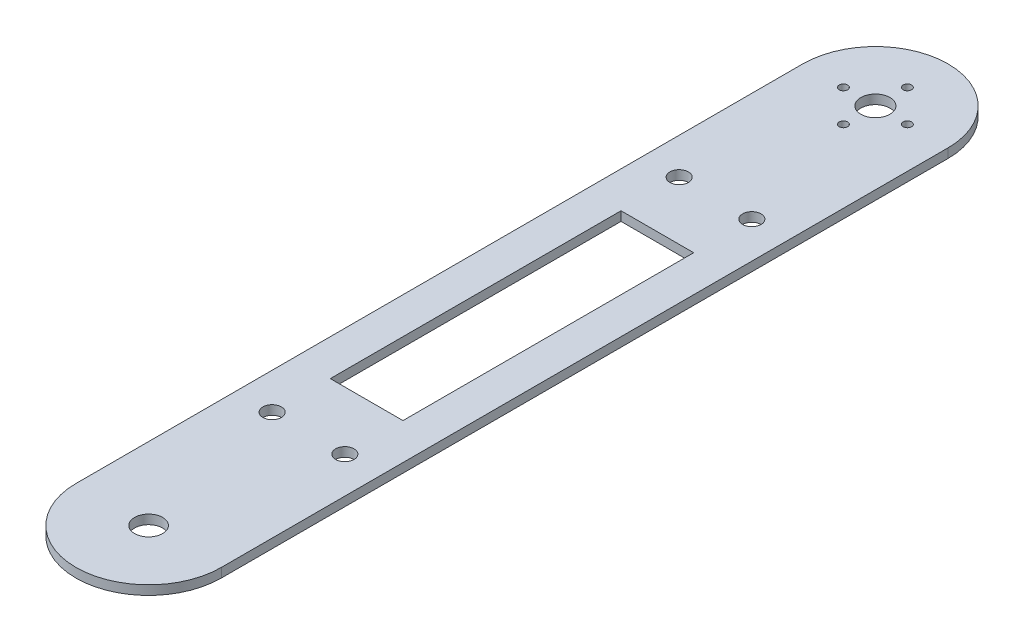
ISO-10303-21;
HEADER;
FILE_DESCRIPTION(('STEP AP214'),'2;1');
FILE_NAME('part.step','',(''),(''),'','','');
FILE_SCHEMA(('AUTOMOTIVE_DESIGN { 1 0 10303 214 1 1 1 1 }'));
ENDSEC;
DATA;
#1=APPLICATION_CONTEXT('core data for automotive mechanical design processes');
#2=APPLICATION_PROTOCOL_DEFINITION('international standard','automotive_design',2000,#1);
#3=PRODUCT_CONTEXT('',#1,'mechanical');
#4=PRODUCT('Part','Part','',(#3));
#5=PRODUCT_RELATED_PRODUCT_CATEGORY('part','',(#4));
#6=PRODUCT_DEFINITION_FORMATION('','',#4);
#7=PRODUCT_DEFINITION_CONTEXT('part definition',#1,'design');
#8=PRODUCT_DEFINITION('design','',#6,#7);
#9=PRODUCT_DEFINITION_SHAPE('','',#8);
#10=(LENGTH_UNIT() NAMED_UNIT(*) SI_UNIT(.MILLI.,.METRE.));
#11=(NAMED_UNIT(*) PLANE_ANGLE_UNIT() SI_UNIT($,.RADIAN.));
#12=(NAMED_UNIT(*) SI_UNIT($,.STERADIAN.) SOLID_ANGLE_UNIT());
#13=UNCERTAINTY_MEASURE_WITH_UNIT(LENGTH_MEASURE(1.E-05),#10,'distance_accuracy_value','');
#14=(GEOMETRIC_REPRESENTATION_CONTEXT(3) GLOBAL_UNCERTAINTY_ASSIGNED_CONTEXT((#13)) GLOBAL_UNIT_ASSIGNED_CONTEXT((#10,
#11,#12)) REPRESENTATION_CONTEXT('',''));
#15=CARTESIAN_POINT('',(0.,0.,0.));
#16=DIRECTION('',(0.,0.,1.));
#17=DIRECTION('',(1.,0.,0.));
#18=AXIS2_PLACEMENT_3D('',#15,#16,#17);
#19=CARTESIAN_POINT('',(0.,3.175,0.));
#20=DIRECTION('',(0.,1.,0.));
#21=DIRECTION('',(0.,0.,1.));
#22=AXIS2_PLACEMENT_3D('',#19,#20,#21);
#23=PLANE('',#22);
#24=CARTESIAN_POINT('',(14.,3.175,25.));
#25=DIRECTION('',(0.,1.,0.));
#26=DIRECTION('',(0.,0.,1.));
#27=AXIS2_PLACEMENT_3D('',#24,#25,#26);
#28=CIRCLE('',#27,1.44999999999999);
#29=CARTESIAN_POINT('',(14.,3.175,26.45));
#30=VERTEX_POINT('',#29);
#31=EDGE_CURVE('E256',#30,#30,#28,.T.);
#32=ORIENTED_EDGE('',*,*,#31,.F.);
#33=EDGE_LOOP('',(#32));
#34=FACE_BOUND('',#33,.T.);
#35=CARTESIAN_POINT('',(25.,3.175,14.));
#36=DIRECTION('',(0.,1.,0.));
#37=DIRECTION('',(0.,0.,1.));
#38=AXIS2_PLACEMENT_3D('',#35,#36,#37);
#39=CIRCLE('',#38,1.44999999999999);
#40=CARTESIAN_POINT('',(25.,3.175,15.45));
#41=VERTEX_POINT('',#40);
#42=EDGE_CURVE('E250',#41,#41,#39,.T.);
#43=ORIENTED_EDGE('',*,*,#42,.F.);
#44=EDGE_LOOP('',(#43));
#45=FACE_BOUND('',#44,.T.);
#46=CARTESIAN_POINT('',(36.,3.175,25.));
#47=DIRECTION('',(0.,1.,0.));
#48=DIRECTION('',(0.,0.,1.));
#49=AXIS2_PLACEMENT_3D('',#46,#47,#48);
#50=CIRCLE('',#49,1.44999999999999);
#51=CARTESIAN_POINT('',(36.,3.175,26.45));
#52=VERTEX_POINT('',#51);
#53=EDGE_CURVE('E244',#52,#52,#50,.T.);
#54=ORIENTED_EDGE('',*,*,#53,.F.);
#55=EDGE_LOOP('',(#54));
#56=FACE_BOUND('',#55,.T.);
#57=CARTESIAN_POINT('',(25.,3.175,36.));
#58=DIRECTION('',(0.,1.,0.));
#59=DIRECTION('',(0.,0.,1.));
#60=AXIS2_PLACEMENT_3D('',#57,#58,#59);
#61=CIRCLE('',#60,1.44999999999999);
#62=CARTESIAN_POINT('',(25.,3.175,37.45));
#63=VERTEX_POINT('',#62);
#64=EDGE_CURVE('E238',#63,#63,#61,.T.);
#65=ORIENTED_EDGE('',*,*,#64,.F.);
#66=EDGE_LOOP('',(#65));
#67=FACE_BOUND('',#66,.T.);
#68=CARTESIAN_POINT('',(37.5,3.175,80.));
#69=DIRECTION('',(0.,1.,0.));
#70=DIRECTION('',(0.,0.,-1.));
#71=AXIS2_PLACEMENT_3D('',#68,#69,#70);
#72=CIRCLE('',#71,3.175);
#73=CARTESIAN_POINT('',(37.5,3.175,76.825));
#74=VERTEX_POINT('',#73);
#75=EDGE_CURVE('E231',#74,#74,#72,.T.);
#76=ORIENTED_EDGE('',*,*,#75,.F.);
#77=EDGE_LOOP('',(#76));
#78=FACE_BOUND('',#77,.T.);
#79=CARTESIAN_POINT('',(37.5,3.175,220.));
#80=DIRECTION('',(0.,1.,0.));
#81=DIRECTION('',(0.,0.,-1.));
#82=AXIS2_PLACEMENT_3D('',#79,#80,#81);
#83=CIRCLE('',#82,3.175);
#84=CARTESIAN_POINT('',(37.5,3.175,216.825));
#85=VERTEX_POINT('',#84);
#86=EDGE_CURVE('E223',#85,#85,#83,.T.);
#87=ORIENTED_EDGE('',*,*,#86,.F.);
#88=EDGE_LOOP('',(#87));
#89=FACE_BOUND('',#88,.T.);
#90=DIRECTION('',(0.,0.,1.));
#91=VECTOR('',#90,1.);
#92=CARTESIAN_POINT('',(12.5,3.175,100.));
#93=LINE('',#92,#91);
#94=CARTESIAN_POINT('',(12.5,3.175,100.));
#95=VERTEX_POINT('',#94);
#96=CARTESIAN_POINT('',(12.5,3.175,200.));
#97=VERTEX_POINT('',#96);
#98=EDGE_CURVE('E86',#95,#97,#93,.T.);
#99=ORIENTED_EDGE('',*,*,#98,.F.);
#100=DIRECTION('',(-1.,0.,0.));
#101=VECTOR('',#100,1.);
#102=CARTESIAN_POINT('',(12.5,3.175,100.));
#103=LINE('',#102,#101);
#104=CARTESIAN_POINT('',(37.5,3.175,100.));
#105=VERTEX_POINT('',#104);
#106=EDGE_CURVE('E154',#105,#95,#103,.T.);
#107=ORIENTED_EDGE('',*,*,#106,.F.);
#108=DIRECTION('',(0.,0.,-1.));
#109=VECTOR('',#108,1.);
#110=CARTESIAN_POINT('',(37.5,3.175,100.));
#111=LINE('',#110,#109);
#112=CARTESIAN_POINT('',(37.5,3.175,200.));
#113=VERTEX_POINT('',#112);
#114=EDGE_CURVE('E139',#113,#105,#111,.T.);
#115=ORIENTED_EDGE('',*,*,#114,.F.);
#116=DIRECTION('',(1.,0.,0.));
#117=VECTOR('',#116,1.);
#118=CARTESIAN_POINT('',(12.5,3.175,200.));
#119=LINE('',#118,#117);
#120=EDGE_CURVE('E148',#97,#113,#119,.T.);
#121=ORIENTED_EDGE('',*,*,#120,.F.);
#122=EDGE_LOOP('',(#99,#107,#115,#121));
#123=FACE_BOUND('',#122,.T.);
#124=CARTESIAN_POINT('',(12.5,3.175,220.));
#125=DIRECTION('',(0.,1.,0.));
#126=DIRECTION('',(0.,0.,1.));
#127=AXIS2_PLACEMENT_3D('',#124,#125,#126);
#128=CIRCLE('',#127,3.175);
#129=CARTESIAN_POINT('',(12.5,3.175,223.175));
#130=VERTEX_POINT('',#129);
#131=EDGE_CURVE('E161',#130,#130,#128,.T.);
#132=ORIENTED_EDGE('',*,*,#131,.F.);
#133=EDGE_LOOP('',(#132));
#134=FACE_BOUND('',#133,.T.);
#135=CARTESIAN_POINT('',(12.5,3.175,80.));
#136=DIRECTION('',(0.,1.,0.));
#137=DIRECTION('',(0.,0.,1.));
#138=AXIS2_PLACEMENT_3D('',#135,#136,#137);
#139=CIRCLE('',#138,3.175);
#140=CARTESIAN_POINT('',(12.5,3.175,83.175));
#141=VERTEX_POINT('',#140);
#142=EDGE_CURVE('E167',#141,#141,#139,.T.);
#143=ORIENTED_EDGE('',*,*,#142,.F.);
#144=EDGE_LOOP('',(#143));
#145=FACE_BOUND('',#144,.T.);
#146=CARTESIAN_POINT('',(25.,3.175,275.));
#147=DIRECTION('',(0.,1.,0.));
#148=DIRECTION('',(0.,0.,1.));
#149=AXIS2_PLACEMENT_3D('',#146,#147,#148);
#150=CIRCLE('',#149,4.82);
#151=CARTESIAN_POINT('',(25.,3.175,279.82));
#152=VERTEX_POINT('',#151);
#153=EDGE_CURVE('E171',#152,#152,#150,.T.);
#154=ORIENTED_EDGE('',*,*,#153,.F.);
#155=EDGE_LOOP('',(#154));
#156=FACE_BOUND('',#155,.T.);
#157=CARTESIAN_POINT('',(25.,3.175,25.));
#158=DIRECTION('',(0.,1.,0.));
#159=DIRECTION('',(0.,0.,1.));
#160=AXIS2_PLACEMENT_3D('',#157,#158,#159);
#161=CIRCLE('',#160,5.);
#162=CARTESIAN_POINT('',(25.,3.175,30.));
#163=VERTEX_POINT('',#162);
#164=EDGE_CURVE('E175',#163,#163,#161,.T.);
#165=ORIENTED_EDGE('',*,*,#164,.F.);
#166=EDGE_LOOP('',(#165));
#167=FACE_BOUND('',#166,.T.);
#168=DIRECTION('',(0.,0.,1.));
#169=VECTOR('',#168,1.);
#170=CARTESIAN_POINT('',(0.,3.175,0.));
#171=LINE('',#170,#169);
#172=CARTESIAN_POINT('',(0.,3.175,25.));
#173=VERTEX_POINT('',#172);
#174=CARTESIAN_POINT('',(0.,3.175,275.));
#175=VERTEX_POINT('',#174);
#176=EDGE_CURVE('E193',#173,#175,#171,.T.);
#177=ORIENTED_EDGE('',*,*,#176,.T.);
#178=CARTESIAN_POINT('',(25.,3.175,275.));
#179=DIRECTION('',(0.,1.,0.));
#180=DIRECTION('',(0.,0.,1.));
#181=AXIS2_PLACEMENT_3D('',#178,#179,#180);
#182=CIRCLE('',#181,25.);
#183=CARTESIAN_POINT('',(50.,3.175,275.));
#184=VERTEX_POINT('',#183);
#185=EDGE_CURVE('E182',#175,#184,#182,.T.);
#186=ORIENTED_EDGE('',*,*,#185,.T.);
#187=DIRECTION('',(0.,0.,-1.));
#188=VECTOR('',#187,1.);
#189=CARTESIAN_POINT('',(50.,3.175,0.));
#190=LINE('',#189,#188);
#191=CARTESIAN_POINT('',(50.,3.175,25.));
#192=VERTEX_POINT('',#191);
#193=EDGE_CURVE('E196',#184,#192,#190,.T.);
#194=ORIENTED_EDGE('',*,*,#193,.T.);
#195=CARTESIAN_POINT('',(25.,3.175,25.));
#196=DIRECTION('',(0.,1.,0.));
#197=DIRECTION('',(0.,0.,1.));
#198=AXIS2_PLACEMENT_3D('',#195,#196,#197);
#199=CIRCLE('',#198,25.);
#200=EDGE_CURVE('E187',#192,#173,#199,.T.);
#201=ORIENTED_EDGE('',*,*,#200,.T.);
#202=EDGE_LOOP('',(#177,#186,#194,#201));
#203=FACE_BOUND('',#202,.T.);
#204=ADVANCED_FACE('F69',(#34,#45,#56,#67,#78,#89,#123,#134,#145,#156,#167,#203),#23,.T.);
#205=CARTESIAN_POINT('',(0.,0.,0.));
#206=DIRECTION('',(0.,1.,0.));
#207=DIRECTION('',(0.,0.,1.));
#208=AXIS2_PLACEMENT_3D('',#205,#206,#207);
#209=PLANE('',#208);
#210=CARTESIAN_POINT('',(14.,0.,25.));
#211=DIRECTION('',(0.,1.,0.));
#212=DIRECTION('',(0.,0.,1.));
#213=AXIS2_PLACEMENT_3D('',#210,#211,#212);
#214=CIRCLE('',#213,1.45);
#215=CARTESIAN_POINT('',(14.,0.,26.45));
#216=VERTEX_POINT('',#215);
#217=EDGE_CURVE('E253',#216,#216,#214,.T.);
#218=ORIENTED_EDGE('',*,*,#217,.T.);
#219=EDGE_LOOP('',(#218));
#220=FACE_BOUND('',#219,.T.);
#221=CARTESIAN_POINT('',(25.,0.,14.));
#222=DIRECTION('',(0.,1.,0.));
#223=DIRECTION('',(0.,0.,1.));
#224=AXIS2_PLACEMENT_3D('',#221,#222,#223);
#225=CIRCLE('',#224,1.45);
#226=CARTESIAN_POINT('',(25.,0.,15.45));
#227=VERTEX_POINT('',#226);
#228=EDGE_CURVE('E247',#227,#227,#225,.T.);
#229=ORIENTED_EDGE('',*,*,#228,.T.);
#230=EDGE_LOOP('',(#229));
#231=FACE_BOUND('',#230,.T.);
#232=CARTESIAN_POINT('',(36.,0.,25.));
#233=DIRECTION('',(0.,1.,0.));
#234=DIRECTION('',(0.,0.,1.));
#235=AXIS2_PLACEMENT_3D('',#232,#233,#234);
#236=CIRCLE('',#235,1.45);
#237=CARTESIAN_POINT('',(36.,0.,26.45));
#238=VERTEX_POINT('',#237);
#239=EDGE_CURVE('E241',#238,#238,#236,.T.);
#240=ORIENTED_EDGE('',*,*,#239,.T.);
#241=EDGE_LOOP('',(#240));
#242=FACE_BOUND('',#241,.T.);
#243=CARTESIAN_POINT('',(25.,0.,36.));
#244=DIRECTION('',(0.,1.,0.));
#245=DIRECTION('',(0.,0.,1.));
#246=AXIS2_PLACEMENT_3D('',#243,#244,#245);
#247=CIRCLE('',#246,1.45);
#248=CARTESIAN_POINT('',(25.,0.,37.45));
#249=VERTEX_POINT('',#248);
#250=EDGE_CURVE('E235',#249,#249,#247,.T.);
#251=ORIENTED_EDGE('',*,*,#250,.T.);
#252=EDGE_LOOP('',(#251));
#253=FACE_BOUND('',#252,.T.);
#254=CARTESIAN_POINT('',(37.5,0.,80.));
#255=DIRECTION('',(0.,1.,0.));
#256=DIRECTION('',(0.,0.,1.));
#257=AXIS2_PLACEMENT_3D('',#254,#255,#256);
#258=CIRCLE('',#257,3.175);
#259=CARTESIAN_POINT('',(37.5,0.,83.175));
#260=VERTEX_POINT('',#259);
#261=EDGE_CURVE('E73',#260,#260,#258,.T.);
#262=ORIENTED_EDGE('',*,*,#261,.T.);
#263=EDGE_LOOP('',(#262));
#264=FACE_BOUND('',#263,.T.);
#265=CARTESIAN_POINT('',(37.5,0.,220.));
#266=DIRECTION('',(0.,1.,0.));
#267=DIRECTION('',(0.,0.,1.));
#268=AXIS2_PLACEMENT_3D('',#265,#266,#267);
#269=CIRCLE('',#268,3.175);
#270=CARTESIAN_POINT('',(37.5,0.,223.175));
#271=VERTEX_POINT('',#270);
#272=EDGE_CURVE('E221',#271,#271,#269,.T.);
#273=ORIENTED_EDGE('',*,*,#272,.T.);
#274=EDGE_LOOP('',(#273));
#275=FACE_BOUND('',#274,.T.);
#276=DIRECTION('',(-1.,0.,0.));
#277=VECTOR('',#276,1.);
#278=CARTESIAN_POINT('',(0.,0.,100.));
#279=LINE('',#278,#277);
#280=CARTESIAN_POINT('',(37.5,0.,100.));
#281=VERTEX_POINT('',#280);
#282=CARTESIAN_POINT('',(12.5,0.,100.));
#283=VERTEX_POINT('',#282);
#284=EDGE_CURVE('E78',#281,#283,#279,.T.);
#285=ORIENTED_EDGE('',*,*,#284,.T.);
#286=DIRECTION('',(0.,0.,1.));
#287=VECTOR('',#286,1.);
#288=CARTESIAN_POINT('',(12.5,0.,0.));
#289=LINE('',#288,#287);
#290=CARTESIAN_POINT('',(12.5,0.,200.));
#291=VERTEX_POINT('',#290);
#292=EDGE_CURVE('E12',#283,#291,#289,.T.);
#293=ORIENTED_EDGE('',*,*,#292,.T.);
#294=DIRECTION('',(1.,0.,0.));
#295=VECTOR('',#294,1.);
#296=CARTESIAN_POINT('',(0.,0.,200.));
#297=LINE('',#296,#295);
#298=CARTESIAN_POINT('',(37.5,0.,200.));
#299=VERTEX_POINT('',#298);
#300=EDGE_CURVE('E209',#291,#299,#297,.T.);
#301=ORIENTED_EDGE('',*,*,#300,.T.);
#302=DIRECTION('',(0.,0.,-1.));
#303=VECTOR('',#302,1.);
#304=CARTESIAN_POINT('',(37.5,0.,0.));
#305=LINE('',#304,#303);
#306=EDGE_CURVE('E142',#299,#281,#305,.T.);
#307=ORIENTED_EDGE('',*,*,#306,.T.);
#308=EDGE_LOOP('',(#285,#293,#301,#307));
#309=FACE_BOUND('',#308,.T.);
#310=CARTESIAN_POINT('',(12.5,0.,220.));
#311=DIRECTION('',(0.,1.,0.));
#312=DIRECTION('',(0.,0.,1.));
#313=AXIS2_PLACEMENT_3D('',#310,#311,#312);
#314=CIRCLE('',#313,3.175);
#315=CARTESIAN_POINT('',(12.5,0.,223.175));
#316=VERTEX_POINT('',#315);
#317=EDGE_CURVE('E166',#316,#316,#314,.T.);
#318=ORIENTED_EDGE('',*,*,#317,.T.);
#319=EDGE_LOOP('',(#318));
#320=FACE_BOUND('',#319,.T.);
#321=CARTESIAN_POINT('',(12.5,0.,80.));
#322=DIRECTION('',(0.,1.,0.));
#323=DIRECTION('',(0.,0.,1.));
#324=AXIS2_PLACEMENT_3D('',#321,#322,#323);
#325=CIRCLE('',#324,3.175);
#326=CARTESIAN_POINT('',(12.5,0.,83.175));
#327=VERTEX_POINT('',#326);
#328=EDGE_CURVE('E170',#327,#327,#325,.T.);
#329=ORIENTED_EDGE('',*,*,#328,.T.);
#330=EDGE_LOOP('',(#329));
#331=FACE_BOUND('',#330,.T.);
#332=CARTESIAN_POINT('',(25.,0.,275.));
#333=DIRECTION('',(0.,1.,0.));
#334=DIRECTION('',(0.,0.,1.));
#335=AXIS2_PLACEMENT_3D('',#332,#333,#334);
#336=CIRCLE('',#335,4.82);
#337=CARTESIAN_POINT('',(25.,0.,279.82));
#338=VERTEX_POINT('',#337);
#339=EDGE_CURVE('E174',#338,#338,#336,.T.);
#340=ORIENTED_EDGE('',*,*,#339,.T.);
#341=EDGE_LOOP('',(#340));
#342=FACE_BOUND('',#341,.T.);
#343=CARTESIAN_POINT('',(25.,0.,25.));
#344=DIRECTION('',(0.,1.,0.));
#345=DIRECTION('',(0.,0.,1.));
#346=AXIS2_PLACEMENT_3D('',#343,#344,#345);
#347=CIRCLE('',#346,5.);
#348=CARTESIAN_POINT('',(25.,0.,30.));
#349=VERTEX_POINT('',#348);
#350=EDGE_CURVE('E178',#349,#349,#347,.T.);
#351=ORIENTED_EDGE('',*,*,#350,.T.);
#352=EDGE_LOOP('',(#351));
#353=FACE_BOUND('',#352,.T.);
#354=CARTESIAN_POINT('',(25.,0.,275.));
#355=DIRECTION('',(0.,1.,0.));
#356=DIRECTION('',(0.,0.,1.));
#357=AXIS2_PLACEMENT_3D('',#354,#355,#356);
#358=CIRCLE('',#357,25.);
#359=CARTESIAN_POINT('',(0.,0.,275.));
#360=VERTEX_POINT('',#359);
#361=CARTESIAN_POINT('',(50.,0.,275.));
#362=VERTEX_POINT('',#361);
#363=EDGE_CURVE('E185',#360,#362,#358,.T.);
#364=ORIENTED_EDGE('',*,*,#363,.F.);
#365=DIRECTION('',(0.,0.,1.));
#366=VECTOR('',#365,1.);
#367=CARTESIAN_POINT('',(0.,0.,0.));
#368=LINE('',#367,#366);
#369=CARTESIAN_POINT('',(0.,0.,25.));
#370=VERTEX_POINT('',#369);
#371=EDGE_CURVE('E192',#370,#360,#368,.T.);
#372=ORIENTED_EDGE('',*,*,#371,.F.);
#373=CARTESIAN_POINT('',(25.,0.,25.));
#374=DIRECTION('',(0.,1.,0.));
#375=DIRECTION('',(0.,0.,1.));
#376=AXIS2_PLACEMENT_3D('',#373,#374,#375);
#377=CIRCLE('',#376,25.);
#378=CARTESIAN_POINT('',(50.,0.,25.));
#379=VERTEX_POINT('',#378);
#380=EDGE_CURVE('E199',#379,#370,#377,.T.);
#381=ORIENTED_EDGE('',*,*,#380,.F.);
#382=DIRECTION('',(0.,0.,-1.));
#383=VECTOR('',#382,1.);
#384=CARTESIAN_POINT('',(50.,0.,0.));
#385=LINE('',#384,#383);
#386=EDGE_CURVE('E197',#362,#379,#385,.T.);
#387=ORIENTED_EDGE('',*,*,#386,.F.);
#388=EDGE_LOOP('',(#364,#372,#381,#387));
#389=FACE_BOUND('',#388,.T.);
#390=ADVANCED_FACE('F264',(#220,#231,#242,#253,#264,#275,#309,#320,#331,#342,#353,#389),#209,.F.);
#391=CARTESIAN_POINT('',(50.,3.175,0.));
#392=DIRECTION('',(-1.,0.,0.));
#393=DIRECTION('',(0.,0.,1.));
#394=AXIS2_PLACEMENT_3D('',#391,#392,#393);
#395=PLANE('',#394);
#396=DIRECTION('',(0.,1.,0.));
#397=VECTOR('',#396,1.);
#398=CARTESIAN_POINT('',(50.,-3.175,275.));
#399=LINE('',#398,#397);
#400=EDGE_CURVE('E207',#362,#184,#399,.T.);
#401=ORIENTED_EDGE('',*,*,#400,.F.);
#402=ORIENTED_EDGE('',*,*,#386,.T.);
#403=DIRECTION('',(0.,1.,0.));
#404=VECTOR('',#403,1.);
#405=CARTESIAN_POINT('',(50.,-3.175,25.));
#406=LINE('',#405,#404);
#407=EDGE_CURVE('E189',#379,#192,#406,.T.);
#408=ORIENTED_EDGE('',*,*,#407,.T.);
#409=ORIENTED_EDGE('',*,*,#193,.F.);
#410=EDGE_LOOP('',(#401,#402,#408,#409));
#411=FACE_BOUND('',#410,.T.);
#412=ADVANCED_FACE('F284',(#411),#395,.F.);
#413=CARTESIAN_POINT('',(0.,3.175,0.));
#414=DIRECTION('',(1.,0.,0.));
#415=DIRECTION('',(0.,0.,-1.));
#416=AXIS2_PLACEMENT_3D('',#413,#414,#415);
#417=PLANE('',#416);
#418=ORIENTED_EDGE('',*,*,#371,.T.);
#419=DIRECTION('',(0.,1.,0.));
#420=VECTOR('',#419,1.);
#421=CARTESIAN_POINT('',(0.,-3.175,275.));
#422=LINE('',#421,#420);
#423=EDGE_CURVE('E179',#360,#175,#422,.T.);
#424=ORIENTED_EDGE('',*,*,#423,.T.);
#425=ORIENTED_EDGE('',*,*,#176,.F.);
#426=DIRECTION('',(0.,1.,0.));
#427=VECTOR('',#426,1.);
#428=CARTESIAN_POINT('',(0.,-3.175,25.));
#429=LINE('',#428,#427);
#430=EDGE_CURVE('E204',#370,#173,#429,.T.);
#431=ORIENTED_EDGE('',*,*,#430,.F.);
#432=EDGE_LOOP('',(#418,#424,#425,#431));
#433=FACE_BOUND('',#432,.T.);
#434=ADVANCED_FACE('F71',(#433),#417,.F.);
#435=CARTESIAN_POINT('',(25.,-3.175,25.));
#436=DIRECTION('',(0.,1.,0.));
#437=DIRECTION('',(0.,0.,1.));
#438=AXIS2_PLACEMENT_3D('',#435,#436,#437);
#439=CYLINDRICAL_SURFACE('',#438,25.);
#440=ORIENTED_EDGE('',*,*,#380,.T.);
#441=ORIENTED_EDGE('',*,*,#430,.T.);
#442=ORIENTED_EDGE('',*,*,#200,.F.);
#443=ORIENTED_EDGE('',*,*,#407,.F.);
#444=EDGE_LOOP('',(#440,#441,#442,#443));
#445=FACE_BOUND('',#444,.T.);
#446=ADVANCED_FACE('F309',(#445),#439,.T.);
#447=CARTESIAN_POINT('',(25.,-3.175,275.));
#448=DIRECTION('',(0.,1.,0.));
#449=DIRECTION('',(0.,0.,1.));
#450=AXIS2_PLACEMENT_3D('',#447,#448,#449);
#451=CYLINDRICAL_SURFACE('',#450,25.);
#452=ORIENTED_EDGE('',*,*,#363,.T.);
#453=ORIENTED_EDGE('',*,*,#400,.T.);
#454=ORIENTED_EDGE('',*,*,#185,.F.);
#455=ORIENTED_EDGE('',*,*,#423,.F.);
#456=EDGE_LOOP('',(#452,#453,#454,#455));
#457=FACE_BOUND('',#456,.T.);
#458=ADVANCED_FACE('F303',(#457),#451,.T.);
#459=CARTESIAN_POINT('',(25.,-3.175,25.));
#460=DIRECTION('',(0.,1.,0.));
#461=DIRECTION('',(0.,0.,1.));
#462=AXIS2_PLACEMENT_3D('',#459,#460,#461);
#463=CYLINDRICAL_SURFACE('',#462,5.);
#464=ORIENTED_EDGE('',*,*,#164,.T.);
#465=EDGE_LOOP('',(#464));
#466=FACE_BOUND('',#465,.T.);
#467=ORIENTED_EDGE('',*,*,#350,.F.);
#468=EDGE_LOOP('',(#467));
#469=FACE_BOUND('',#468,.T.);
#470=ADVANCED_FACE('F324',(#466,#469),#463,.F.);
#471=CARTESIAN_POINT('',(25.,-3.175,275.));
#472=DIRECTION('',(0.,1.,0.));
#473=DIRECTION('',(0.,0.,1.));
#474=AXIS2_PLACEMENT_3D('',#471,#472,#473);
#475=CYLINDRICAL_SURFACE('',#474,4.82);
#476=ORIENTED_EDGE('',*,*,#153,.T.);
#477=EDGE_LOOP('',(#476));
#478=FACE_BOUND('',#477,.T.);
#479=ORIENTED_EDGE('',*,*,#339,.F.);
#480=EDGE_LOOP('',(#479));
#481=FACE_BOUND('',#480,.T.);
#482=ADVANCED_FACE('F327',(#478,#481),#475,.F.);
#483=CARTESIAN_POINT('',(12.5,-3.175,80.));
#484=DIRECTION('',(0.,1.,0.));
#485=DIRECTION('',(0.,0.,1.));
#486=AXIS2_PLACEMENT_3D('',#483,#484,#485);
#487=CYLINDRICAL_SURFACE('',#486,3.175);
#488=ORIENTED_EDGE('',*,*,#142,.T.);
#489=EDGE_LOOP('',(#488));
#490=FACE_BOUND('',#489,.T.);
#491=ORIENTED_EDGE('',*,*,#328,.F.);
#492=EDGE_LOOP('',(#491));
#493=FACE_BOUND('',#492,.T.);
#494=ADVANCED_FACE('F331',(#490,#493),#487,.F.);
#495=CARTESIAN_POINT('',(12.5,-3.175,220.));
#496=DIRECTION('',(0.,1.,0.));
#497=DIRECTION('',(0.,0.,1.));
#498=AXIS2_PLACEMENT_3D('',#495,#496,#497);
#499=CYLINDRICAL_SURFACE('',#498,3.175);
#500=ORIENTED_EDGE('',*,*,#131,.T.);
#501=EDGE_LOOP('',(#500));
#502=FACE_BOUND('',#501,.T.);
#503=ORIENTED_EDGE('',*,*,#317,.F.);
#504=EDGE_LOOP('',(#503));
#505=FACE_BOUND('',#504,.T.);
#506=ADVANCED_FACE('F335',(#502,#505),#499,.F.);
#507=CARTESIAN_POINT('',(12.5,-3.175,100.));
#508=DIRECTION('',(-1.,0.,0.));
#509=DIRECTION('',(0.,0.,1.));
#510=AXIS2_PLACEMENT_3D('',#507,#508,#509);
#511=PLANE('',#510);
#512=DIRECTION('',(0.,1.,0.));
#513=VECTOR('',#512,1.);
#514=CARTESIAN_POINT('',(12.5,-3.175,100.));
#515=LINE('',#514,#513);
#516=EDGE_CURVE('E159',#283,#95,#515,.T.);
#517=ORIENTED_EDGE('',*,*,#516,.T.);
#518=ORIENTED_EDGE('',*,*,#98,.T.);
#519=DIRECTION('',(0.,1.,0.));
#520=VECTOR('',#519,1.);
#521=CARTESIAN_POINT('',(12.5,-3.175,200.));
#522=LINE('',#521,#520);
#523=EDGE_CURVE('E145',#291,#97,#522,.T.);
#524=ORIENTED_EDGE('',*,*,#523,.F.);
#525=ORIENTED_EDGE('',*,*,#292,.F.);
#526=EDGE_LOOP('',(#517,#518,#524,#525));
#527=FACE_BOUND('',#526,.T.);
#528=ADVANCED_FACE('F339',(#527),#511,.F.);
#529=CARTESIAN_POINT('',(12.5,-3.175,100.));
#530=DIRECTION('',(0.,0.,-1.));
#531=DIRECTION('',(-1.,0.,0.));
#532=AXIS2_PLACEMENT_3D('',#529,#530,#531);
#533=PLANE('',#532);
#534=DIRECTION('',(0.,1.,0.));
#535=VECTOR('',#534,1.);
#536=CARTESIAN_POINT('',(37.5,-3.175,100.));
#537=LINE('',#536,#535);
#538=EDGE_CURVE('E144',#281,#105,#537,.T.);
#539=ORIENTED_EDGE('',*,*,#538,.T.);
#540=ORIENTED_EDGE('',*,*,#106,.T.);
#541=ORIENTED_EDGE('',*,*,#516,.F.);
#542=ORIENTED_EDGE('',*,*,#284,.F.);
#543=EDGE_LOOP('',(#539,#540,#541,#542));
#544=FACE_BOUND('',#543,.T.);
#545=ADVANCED_FACE('F343',(#544),#533,.F.);
#546=CARTESIAN_POINT('',(37.5,-3.175,100.));
#547=DIRECTION('',(1.,0.,0.));
#548=DIRECTION('',(0.,0.,-1.));
#549=AXIS2_PLACEMENT_3D('',#546,#547,#548);
#550=PLANE('',#549);
#551=DIRECTION('',(0.,1.,0.));
#552=VECTOR('',#551,1.);
#553=CARTESIAN_POINT('',(37.5,-3.175,200.));
#554=LINE('',#553,#552);
#555=EDGE_CURVE('E94',#299,#113,#554,.T.);
#556=ORIENTED_EDGE('',*,*,#555,.T.);
#557=ORIENTED_EDGE('',*,*,#114,.T.);
#558=ORIENTED_EDGE('',*,*,#538,.F.);
#559=ORIENTED_EDGE('',*,*,#306,.F.);
#560=EDGE_LOOP('',(#556,#557,#558,#559));
#561=FACE_BOUND('',#560,.T.);
#562=ADVANCED_FACE('F136',(#561),#550,.F.);
#563=CARTESIAN_POINT('',(12.5,-3.175,200.));
#564=DIRECTION('',(0.,0.,1.));
#565=DIRECTION('',(1.,0.,0.));
#566=AXIS2_PLACEMENT_3D('',#563,#564,#565);
#567=PLANE('',#566);
#568=ORIENTED_EDGE('',*,*,#523,.T.);
#569=ORIENTED_EDGE('',*,*,#120,.T.);
#570=ORIENTED_EDGE('',*,*,#555,.F.);
#571=ORIENTED_EDGE('',*,*,#300,.F.);
#572=EDGE_LOOP('',(#568,#569,#570,#571));
#573=FACE_BOUND('',#572,.T.);
#574=ADVANCED_FACE('F149',(#573),#567,.F.);
#575=CARTESIAN_POINT('',(37.5,-3.175,220.));
#576=DIRECTION('',(0.,1.,0.));
#577=DIRECTION('',(0.,0.,1.));
#578=AXIS2_PLACEMENT_3D('',#575,#576,#577);
#579=CYLINDRICAL_SURFACE('',#578,3.175);
#580=ORIENTED_EDGE('',*,*,#86,.T.);
#581=EDGE_LOOP('',(#580));
#582=FACE_BOUND('',#581,.T.);
#583=ORIENTED_EDGE('',*,*,#272,.F.);
#584=EDGE_LOOP('',(#583));
#585=FACE_BOUND('',#584,.T.);
#586=ADVANCED_FACE('F279',(#582,#585),#579,.F.);
#587=CARTESIAN_POINT('',(37.5,-3.175,80.));
#588=DIRECTION('',(0.,1.,0.));
#589=DIRECTION('',(0.,0.,1.));
#590=AXIS2_PLACEMENT_3D('',#587,#588,#589);
#591=CYLINDRICAL_SURFACE('',#590,3.175);
#592=ORIENTED_EDGE('',*,*,#75,.T.);
#593=EDGE_LOOP('',(#592));
#594=FACE_BOUND('',#593,.T.);
#595=ORIENTED_EDGE('',*,*,#261,.F.);
#596=EDGE_LOOP('',(#595));
#597=FACE_BOUND('',#596,.T.);
#598=ADVANCED_FACE('F275',(#594,#597),#591,.F.);
#599=CARTESIAN_POINT('',(25.,3.175,36.));
#600=DIRECTION('',(0.,1.,0.));
#601=DIRECTION('',(0.,0.,1.));
#602=AXIS2_PLACEMENT_3D('',#599,#600,#601);
#603=CYLINDRICAL_SURFACE('',#602,1.44999999999999);
#604=ORIENTED_EDGE('',*,*,#250,.F.);
#605=EDGE_LOOP('',(#604));
#606=FACE_BOUND('',#605,.T.);
#607=ORIENTED_EDGE('',*,*,#64,.T.);
#608=EDGE_LOOP('',(#607));
#609=FACE_BOUND('',#608,.T.);
#610=ADVANCED_FACE('F278',(#606,#609),#603,.F.);
#611=CARTESIAN_POINT('',(36.,3.175,25.));
#612=DIRECTION('',(0.,1.,0.));
#613=DIRECTION('',(0.,0.,1.));
#614=AXIS2_PLACEMENT_3D('',#611,#612,#613);
#615=CYLINDRICAL_SURFACE('',#614,1.44999999999999);
#616=ORIENTED_EDGE('',*,*,#239,.F.);
#617=EDGE_LOOP('',(#616));
#618=FACE_BOUND('',#617,.T.);
#619=ORIENTED_EDGE('',*,*,#53,.T.);
#620=EDGE_LOOP('',(#619));
#621=FACE_BOUND('',#620,.T.);
#622=ADVANCED_FACE('F355',(#618,#621),#615,.F.);
#623=CARTESIAN_POINT('',(25.,3.175,14.));
#624=DIRECTION('',(0.,1.,0.));
#625=DIRECTION('',(0.,0.,1.));
#626=AXIS2_PLACEMENT_3D('',#623,#624,#625);
#627=CYLINDRICAL_SURFACE('',#626,1.44999999999999);
#628=ORIENTED_EDGE('',*,*,#228,.F.);
#629=EDGE_LOOP('',(#628));
#630=FACE_BOUND('',#629,.T.);
#631=ORIENTED_EDGE('',*,*,#42,.T.);
#632=EDGE_LOOP('',(#631));
#633=FACE_BOUND('',#632,.T.);
#634=ADVANCED_FACE('F359',(#630,#633),#627,.F.);
#635=CARTESIAN_POINT('',(14.,3.175,25.));
#636=DIRECTION('',(0.,1.,0.));
#637=DIRECTION('',(0.,0.,1.));
#638=AXIS2_PLACEMENT_3D('',#635,#636,#637);
#639=CYLINDRICAL_SURFACE('',#638,1.44999999999999);
#640=ORIENTED_EDGE('',*,*,#217,.F.);
#641=EDGE_LOOP('',(#640));
#642=FACE_BOUND('',#641,.T.);
#643=ORIENTED_EDGE('',*,*,#31,.T.);
#644=EDGE_LOOP('',(#643));
#645=FACE_BOUND('',#644,.T.);
#646=ADVANCED_FACE('F260',(#642,#645),#639,.F.);
#647=CLOSED_SHELL('',(#204,#390,#412,#434,#446,#458,#470,#482,#494,#506,#528,#545,#562,#574,
#586,#598,#610,#622,#634,#646));
#648=MANIFOLD_SOLID_BREP('B2',#647);
#649=ADVANCED_BREP_SHAPE_REPRESENTATION('',(#18,#648),#14);
#650=SHAPE_DEFINITION_REPRESENTATION(#9,#649);
ENDSEC;
END-ISO-10303-21;
